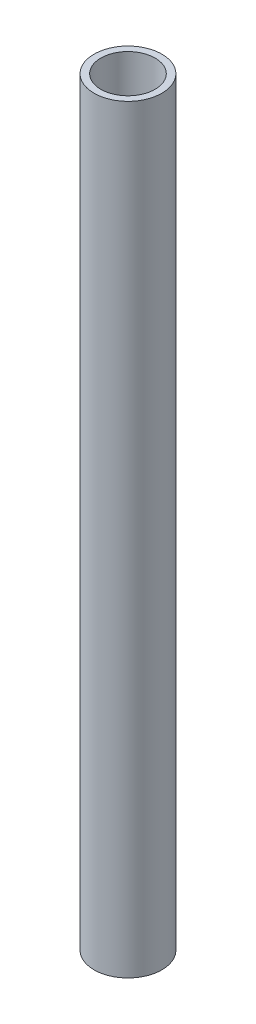
ISO-10303-21;
HEADER;
FILE_DESCRIPTION(('STEP AP214'),'2;1');
FILE_NAME('part.step','',(''),(''),'','','');
FILE_SCHEMA(('AUTOMOTIVE_DESIGN { 1 0 10303 214 1 1 1 1 }'));
ENDSEC;
DATA;
#1=APPLICATION_CONTEXT('core data for automotive mechanical design processes');
#2=APPLICATION_PROTOCOL_DEFINITION('international standard','automotive_design',2000,#1);
#3=PRODUCT_CONTEXT('',#1,'mechanical');
#4=PRODUCT('Part','Part','',(#3));
#5=PRODUCT_RELATED_PRODUCT_CATEGORY('part','',(#4));
#6=PRODUCT_DEFINITION_FORMATION('','',#4);
#7=PRODUCT_DEFINITION_CONTEXT('part definition',#1,'design');
#8=PRODUCT_DEFINITION('design','',#6,#7);
#9=PRODUCT_DEFINITION_SHAPE('','',#8);
#10=(LENGTH_UNIT() NAMED_UNIT(*) SI_UNIT(.MILLI.,.METRE.));
#11=(NAMED_UNIT(*) PLANE_ANGLE_UNIT() SI_UNIT($,.RADIAN.));
#12=(NAMED_UNIT(*) SI_UNIT($,.STERADIAN.) SOLID_ANGLE_UNIT());
#13=UNCERTAINTY_MEASURE_WITH_UNIT(LENGTH_MEASURE(1.E-05),#10,'distance_accuracy_value','');
#14=(GEOMETRIC_REPRESENTATION_CONTEXT(3) GLOBAL_UNCERTAINTY_ASSIGNED_CONTEXT((#13)) GLOBAL_UNIT_ASSIGNED_CONTEXT((#10,
#11,#12)) REPRESENTATION_CONTEXT('',''));
#15=CARTESIAN_POINT('',(0.,0.,0.));
#16=DIRECTION('',(0.,0.,1.));
#17=DIRECTION('',(1.,0.,0.));
#18=AXIS2_PLACEMENT_3D('',#15,#16,#17);
#19=CARTESIAN_POINT('',(0.,112.,0.));
#20=DIRECTION('',(0.,1.,0.));
#21=DIRECTION('',(0.,0.,1.));
#22=AXIS2_PLACEMENT_3D('',#19,#20,#21);
#23=PLANE('',#22);
#24=CARTESIAN_POINT('',(0.,112.,0.));
#25=DIRECTION('',(0.,1.,0.));
#26=DIRECTION('',(0.,0.,1.));
#27=AXIS2_PLACEMENT_3D('',#24,#25,#26);
#28=CIRCLE('',#27,5.);
#29=CARTESIAN_POINT('',(0.,112.,5.));
#30=VERTEX_POINT('',#29);
#31=EDGE_CURVE('E10',#30,#30,#28,.T.);
#32=ORIENTED_EDGE('',*,*,#31,.T.);
#33=EDGE_LOOP('',(#32));
#34=FACE_BOUND('',#33,.T.);
#35=CARTESIAN_POINT('',(0.,112.,0.));
#36=DIRECTION('',(0.,1.,0.));
#37=DIRECTION('',(0.,0.,1.));
#38=AXIS2_PLACEMENT_3D('',#35,#36,#37);
#39=CIRCLE('',#38,4.);
#40=CARTESIAN_POINT('',(0.,112.,4.));
#41=VERTEX_POINT('',#40);
#42=EDGE_CURVE('E48',#41,#41,#39,.T.);
#43=ORIENTED_EDGE('',*,*,#42,.F.);
#44=EDGE_LOOP('',(#43));
#45=FACE_BOUND('',#44,.T.);
#46=ADVANCED_FACE('F37',(#34,#45),#23,.T.);
#47=CARTESIAN_POINT('',(0.,0.,0.));
#48=DIRECTION('',(0.,1.,0.));
#49=DIRECTION('',(0.,0.,1.));
#50=AXIS2_PLACEMENT_3D('',#47,#48,#49);
#51=PLANE('',#50);
#52=CARTESIAN_POINT('',(0.,0.,0.));
#53=DIRECTION('',(0.,1.,0.));
#54=DIRECTION('',(0.,0.,1.));
#55=AXIS2_PLACEMENT_3D('',#52,#53,#54);
#56=CIRCLE('',#55,5.);
#57=CARTESIAN_POINT('',(0.,0.,5.));
#58=VERTEX_POINT('',#57);
#59=EDGE_CURVE('E41',#58,#58,#56,.T.);
#60=ORIENTED_EDGE('',*,*,#59,.F.);
#61=EDGE_LOOP('',(#60));
#62=FACE_BOUND('',#61,.T.);
#63=CARTESIAN_POINT('',(0.,0.,0.));
#64=DIRECTION('',(0.,1.,0.));
#65=DIRECTION('',(0.,0.,1.));
#66=AXIS2_PLACEMENT_3D('',#63,#64,#65);
#67=CIRCLE('',#66,4.);
#68=CARTESIAN_POINT('',(0.,0.,4.));
#69=VERTEX_POINT('',#68);
#70=EDGE_CURVE('E50',#69,#69,#67,.T.);
#71=ORIENTED_EDGE('',*,*,#70,.T.);
#72=EDGE_LOOP('',(#71));
#73=FACE_BOUND('',#72,.T.);
#74=ADVANCED_FACE('F60',(#62,#73),#51,.F.);
#75=CARTESIAN_POINT('',(0.,112.,0.));
#76=DIRECTION('',(0.,-1.,0.));
#77=DIRECTION('',(0.,0.,-1.));
#78=AXIS2_PLACEMENT_3D('',#75,#76,#77);
#79=CYLINDRICAL_SURFACE('',#78,5.);
#80=ORIENTED_EDGE('',*,*,#31,.F.);
#81=EDGE_LOOP('',(#80));
#82=FACE_BOUND('',#81,.T.);
#83=ORIENTED_EDGE('',*,*,#59,.T.);
#84=EDGE_LOOP('',(#83));
#85=FACE_BOUND('',#84,.T.);
#86=ADVANCED_FACE('F39',(#82,#85),#79,.T.);
#87=CARTESIAN_POINT('',(0.,112.,0.));
#88=DIRECTION('',(0.,-1.,0.));
#89=DIRECTION('',(0.,0.,-1.));
#90=AXIS2_PLACEMENT_3D('',#87,#88,#89);
#91=CYLINDRICAL_SURFACE('',#90,4.);
#92=ORIENTED_EDGE('',*,*,#42,.T.);
#93=EDGE_LOOP('',(#92));
#94=FACE_BOUND('',#93,.T.);
#95=ORIENTED_EDGE('',*,*,#70,.F.);
#96=EDGE_LOOP('',(#95));
#97=FACE_BOUND('',#96,.T.);
#98=ADVANCED_FACE('F56',(#94,#97),#91,.F.);
#99=CLOSED_SHELL('',(#46,#74,#86,#98));
#100=MANIFOLD_SOLID_BREP('B2',#99);
#101=ADVANCED_BREP_SHAPE_REPRESENTATION('',(#18,#100),#14);
#102=SHAPE_DEFINITION_REPRESENTATION(#9,#101);
ENDSEC;
END-ISO-10303-21;
